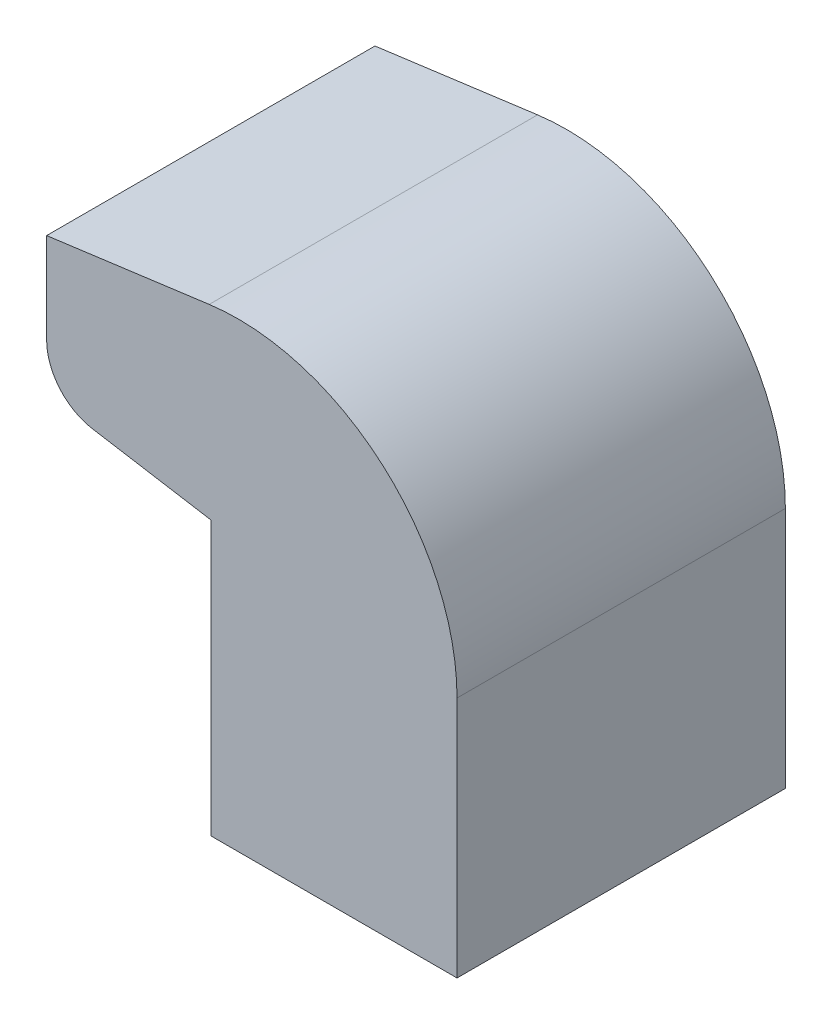
ISO-10303-21;
HEADER;
FILE_DESCRIPTION(('STEP AP214'),'2;1');
FILE_NAME('part.step','',(''),(''),'','','');
FILE_SCHEMA(('AUTOMOTIVE_DESIGN { 1 0 10303 214 1 1 1 1 }'));
ENDSEC;
DATA;
#1=APPLICATION_CONTEXT('core data for automotive mechanical design processes');
#2=APPLICATION_PROTOCOL_DEFINITION('international standard','automotive_design',2000,#1);
#3=PRODUCT_CONTEXT('',#1,'mechanical');
#4=PRODUCT('Part','Part','',(#3));
#5=PRODUCT_RELATED_PRODUCT_CATEGORY('part','',(#4));
#6=PRODUCT_DEFINITION_FORMATION('','',#4);
#7=PRODUCT_DEFINITION_CONTEXT('part definition',#1,'design');
#8=PRODUCT_DEFINITION('design','',#6,#7);
#9=PRODUCT_DEFINITION_SHAPE('','',#8);
#10=(LENGTH_UNIT() NAMED_UNIT(*) SI_UNIT(.MILLI.,.METRE.));
#11=(NAMED_UNIT(*) PLANE_ANGLE_UNIT() SI_UNIT($,.RADIAN.));
#12=(NAMED_UNIT(*) SI_UNIT($,.STERADIAN.) SOLID_ANGLE_UNIT());
#13=UNCERTAINTY_MEASURE_WITH_UNIT(LENGTH_MEASURE(1.E-05),#10,'distance_accuracy_value','');
#14=(GEOMETRIC_REPRESENTATION_CONTEXT(3) GLOBAL_UNCERTAINTY_ASSIGNED_CONTEXT((#13)) GLOBAL_UNIT_ASSIGNED_CONTEXT((#10,
#11,#12)) REPRESENTATION_CONTEXT('',''));
#15=CARTESIAN_POINT('',(0.,0.,0.));
#16=DIRECTION('',(0.,0.,1.));
#17=DIRECTION('',(1.,0.,0.));
#18=AXIS2_PLACEMENT_3D('',#15,#16,#17);
#19=CARTESIAN_POINT('',(0.,0.,30.));
#20=DIRECTION('',(0.,1.,0.));
#21=DIRECTION('',(0.,0.,1.));
#22=AXIS2_PLACEMENT_3D('',#19,#20,#21);
#23=PLANE('',#22);
#24=DIRECTION('',(-1.,0.,0.));
#25=VECTOR('',#24,1.);
#26=CARTESIAN_POINT('',(0.,0.,25.));
#27=LINE('',#26,#25);
#28=CARTESIAN_POINT('',(40.,0.,25.));
#29=VERTEX_POINT('',#28);
#30=CARTESIAN_POINT('',(5.,0.,25.));
#31=VERTEX_POINT('',#30);
#32=EDGE_CURVE('E168',#29,#31,#27,.T.);
#33=ORIENTED_EDGE('',*,*,#32,.T.);
#34=DIRECTION('',(0.,0.,-1.));
#35=VECTOR('',#34,1.);
#36=CARTESIAN_POINT('',(5.,0.,30.));
#37=LINE('',#36,#35);
#38=CARTESIAN_POINT('',(5.,0.,-25.));
#39=VERTEX_POINT('',#38);
#40=EDGE_CURVE('E170',#31,#39,#37,.T.);
#41=ORIENTED_EDGE('',*,*,#40,.T.);
#42=DIRECTION('',(1.,0.,0.));
#43=VECTOR('',#42,1.);
#44=CARTESIAN_POINT('',(45.,0.,-25.));
#45=LINE('',#44,#43);
#46=CARTESIAN_POINT('',(40.,0.,-25.));
#47=VERTEX_POINT('',#46);
#48=EDGE_CURVE('E130',#39,#47,#45,.T.);
#49=ORIENTED_EDGE('',*,*,#48,.T.);
#50=DIRECTION('',(0.,0.,1.));
#51=VECTOR('',#50,1.);
#52=CARTESIAN_POINT('',(40.,0.,30.));
#53=LINE('',#52,#51);
#54=EDGE_CURVE('E166',#47,#29,#53,.T.);
#55=ORIENTED_EDGE('',*,*,#54,.T.);
#56=EDGE_LOOP('',(#33,#41,#49,#55));
#57=FACE_BOUND('',#56,.T.);
#58=ADVANCED_FACE('F34',(#57),#23,.F.);
#59=CARTESIAN_POINT('',(45.,0.,30.));
#60=DIRECTION('',(-1.,0.,0.));
#61=DIRECTION('',(0.,0.,1.));
#62=AXIS2_PLACEMENT_3D('',#59,#60,#61);
#63=PLANE('',#62);
#64=DIRECTION('',(0.,1.,0.));
#65=VECTOR('',#64,1.);
#66=CARTESIAN_POINT('',(45.,0.,30.));
#67=LINE('',#66,#65);
#68=CARTESIAN_POINT('',(45.,5.00000000000003,30.));
#69=VERTEX_POINT('',#68);
#70=CARTESIAN_POINT('',(45.,49.3126774655425,30.));
#71=VERTEX_POINT('',#70);
#72=EDGE_CURVE('E110',#69,#71,#67,.T.);
#73=ORIENTED_EDGE('',*,*,#72,.F.);
#74=DIRECTION('',(0.,0.,-1.));
#75=VECTOR('',#74,1.);
#76=CARTESIAN_POINT('',(45.,5.00000000000003,30.));
#77=LINE('',#76,#75);
#78=CARTESIAN_POINT('',(45.,5.00000000000003,-30.));
#79=VERTEX_POINT('',#78);
#80=EDGE_CURVE('E177',#69,#79,#77,.T.);
#81=ORIENTED_EDGE('',*,*,#80,.T.);
#82=DIRECTION('',(0.,1.,0.));
#83=VECTOR('',#82,1.);
#84=CARTESIAN_POINT('',(45.,0.,-30.));
#85=LINE('',#84,#83);
#86=CARTESIAN_POINT('',(45.,49.3126774655425,-30.));
#87=VERTEX_POINT('',#86);
#88=EDGE_CURVE('E127',#79,#87,#85,.T.);
#89=ORIENTED_EDGE('',*,*,#88,.T.);
#90=DIRECTION('',(0.,0.,-1.));
#91=VECTOR('',#90,1.);
#92=CARTESIAN_POINT('',(45.,49.3126774655425,30.));
#93=LINE('',#92,#91);
#94=EDGE_CURVE('E124',#71,#87,#93,.T.);
#95=ORIENTED_EDGE('',*,*,#94,.F.);
#96=EDGE_LOOP('',(#73,#81,#89,#95));
#97=FACE_BOUND('',#96,.T.);
#98=ADVANCED_FACE('F125',(#97),#63,.F.);
#99=CARTESIAN_POINT('',(5.,49.3126774655425,30.));
#100=DIRECTION('',(0.,0.,-1.));
#101=DIRECTION('',(-1.,0.,0.));
#102=AXIS2_PLACEMENT_3D('',#99,#100,#101);
#103=CYLINDRICAL_SURFACE('',#102,40.);
#104=CARTESIAN_POINT('',(5.,49.3126774655425,-30.));
#105=DIRECTION('',(0.,0.,1.));
#106=DIRECTION('',(-1.,0.,0.));
#107=AXIS2_PLACEMENT_3D('',#104,#105,#106);
#108=CIRCLE('',#107,40.);
#109=CARTESIAN_POINT('',(-0.286548803640719,88.9617934928479,-30.));
#110=VERTEX_POINT('',#109);
#111=EDGE_CURVE('E148',#87,#110,#108,.T.);
#112=ORIENTED_EDGE('',*,*,#111,.T.);
#113=DIRECTION('',(0.,0.,-1.));
#114=VECTOR('',#113,1.);
#115=CARTESIAN_POINT('',(-0.286548803640719,88.9617934928479,30.));
#116=LINE('',#115,#114);
#117=CARTESIAN_POINT('',(-0.286548803640719,88.9617934928479,30.));
#118=VERTEX_POINT('',#117);
#119=EDGE_CURVE('E131',#118,#110,#116,.T.);
#120=ORIENTED_EDGE('',*,*,#119,.F.);
#121=CARTESIAN_POINT('',(5.,49.3126774655425,30.));
#122=DIRECTION('',(0.,0.,1.));
#123=DIRECTION('',(-1.,0.,0.));
#124=AXIS2_PLACEMENT_3D('',#121,#122,#123);
#125=CIRCLE('',#124,40.);
#126=EDGE_CURVE('E114',#71,#118,#125,.T.);
#127=ORIENTED_EDGE('',*,*,#126,.F.);
#128=ORIENTED_EDGE('',*,*,#94,.T.);
#129=EDGE_LOOP('',(#112,#120,#127,#128));
#130=FACE_BOUND('',#129,.T.);
#131=ADVANCED_FACE('F133',(#130),#103,.T.);
#132=CARTESIAN_POINT('',(-30.,85.,30.));
#133=DIRECTION('',(0.132163720091018,-0.991227900682635,0.));
#134=DIRECTION('',(0.991227900682635,0.132163720091018,0.));
#135=AXIS2_PLACEMENT_3D('',#132,#133,#134);
#136=PLANE('',#135);
#137=DIRECTION('',(-0.991227900682635,-0.132163720091018,0.));
#138=VECTOR('',#137,1.);
#139=CARTESIAN_POINT('',(-30.,85.,-30.));
#140=LINE('',#139,#138);
#141=CARTESIAN_POINT('',(-30.,85.,-30.));
#142=VERTEX_POINT('',#141);
#143=EDGE_CURVE('E151',#110,#142,#140,.T.);
#144=ORIENTED_EDGE('',*,*,#143,.T.);
#145=DIRECTION('',(0.,0.,-1.));
#146=VECTOR('',#145,1.);
#147=CARTESIAN_POINT('',(-30.,85.,30.));
#148=LINE('',#147,#146);
#149=CARTESIAN_POINT('',(-30.,85.,30.));
#150=VERTEX_POINT('',#149);
#151=EDGE_CURVE('E161',#150,#142,#148,.T.);
#152=ORIENTED_EDGE('',*,*,#151,.F.);
#153=DIRECTION('',(-0.991227900682635,-0.132163720091018,0.));
#154=VECTOR('',#153,1.);
#155=CARTESIAN_POINT('',(-30.,85.,30.));
#156=LINE('',#155,#154);
#157=EDGE_CURVE('E136',#118,#150,#156,.T.);
#158=ORIENTED_EDGE('',*,*,#157,.F.);
#159=ORIENTED_EDGE('',*,*,#119,.T.);
#160=EDGE_LOOP('',(#144,#152,#158,#159));
#161=FACE_BOUND('',#160,.T.);
#162=ADVANCED_FACE('F226',(#161),#136,.F.);
#163=CARTESIAN_POINT('',(-30.,60.,30.));
#164=DIRECTION('',(1.,0.,0.));
#165=DIRECTION('',(0.,0.,-1.));
#166=AXIS2_PLACEMENT_3D('',#163,#164,#165);
#167=PLANE('',#166);
#168=DIRECTION('',(0.,-1.,0.));
#169=VECTOR('',#168,1.);
#170=CARTESIAN_POINT('',(-30.,60.,-30.));
#171=LINE('',#170,#169);
#172=CARTESIAN_POINT('',(-30.,68.4712708838304,-30.));
#173=VERTEX_POINT('',#172);
#174=EDGE_CURVE('E153',#142,#173,#171,.T.);
#175=ORIENTED_EDGE('',*,*,#174,.T.);
#176=DIRECTION('',(0.,0.,-1.));
#177=VECTOR('',#176,1.);
#178=CARTESIAN_POINT('',(-30.,68.4712708838304,30.));
#179=LINE('',#178,#177);
#180=CARTESIAN_POINT('',(-30.,68.4712708838304,30.));
#181=VERTEX_POINT('',#180);
#182=EDGE_CURVE('E42',#173,#181,#179,.F.);
#183=ORIENTED_EDGE('',*,*,#182,.T.);
#184=DIRECTION('',(0.,-1.,0.));
#185=VECTOR('',#184,1.);
#186=CARTESIAN_POINT('',(-30.,60.,30.));
#187=LINE('',#186,#185);
#188=EDGE_CURVE('E138',#150,#181,#187,.T.);
#189=ORIENTED_EDGE('',*,*,#188,.F.);
#190=ORIENTED_EDGE('',*,*,#151,.T.);
#191=EDGE_LOOP('',(#175,#183,#189,#190));
#192=FACE_BOUND('',#191,.T.);
#193=ADVANCED_FACE('F258',(#192),#167,.F.);
#194=CARTESIAN_POINT('',(0.,55.,30.));
#195=DIRECTION('',(0.164398987305357,0.986393923832144,0.));
#196=DIRECTION('',(-0.986393923832144,0.164398987305357,0.));
#197=AXIS2_PLACEMENT_3D('',#194,#195,#196);
#198=PLANE('',#197);
#199=DIRECTION('',(0.986393923832144,-0.164398987305357,0.));
#200=VECTOR('',#199,1.);
#201=CARTESIAN_POINT('',(0.,55.,30.));
#202=LINE('',#201,#200);
#203=CARTESIAN_POINT('',(-21.6439898730536,58.6073316455089,30.));
#204=VERTEX_POINT('',#203);
#205=CARTESIAN_POINT('',(0.,55.,30.));
#206=VERTEX_POINT('',#205);
#207=EDGE_CURVE('E142',#204,#206,#202,.T.);
#208=ORIENTED_EDGE('',*,*,#207,.F.);
#209=DIRECTION('',(0.,0.,-1.));
#210=VECTOR('',#209,1.);
#211=CARTESIAN_POINT('',(-21.6439898730536,58.6073316455089,30.));
#212=LINE('',#211,#210);
#213=CARTESIAN_POINT('',(-21.6439898730536,58.6073316455089,-30.));
#214=VERTEX_POINT('',#213);
#215=EDGE_CURVE('E181',#204,#214,#212,.T.);
#216=ORIENTED_EDGE('',*,*,#215,.T.);
#217=DIRECTION('',(0.986393923832144,-0.164398987305357,0.));
#218=VECTOR('',#217,1.);
#219=CARTESIAN_POINT('',(0.,55.,-30.));
#220=LINE('',#219,#218);
#221=CARTESIAN_POINT('',(0.,55.,-30.));
#222=VERTEX_POINT('',#221);
#223=EDGE_CURVE('E155',#214,#222,#220,.T.);
#224=ORIENTED_EDGE('',*,*,#223,.T.);
#225=DIRECTION('',(0.,0.,-1.));
#226=VECTOR('',#225,1.);
#227=CARTESIAN_POINT('',(0.,55.,30.));
#228=LINE('',#227,#226);
#229=EDGE_CURVE('E146',#206,#222,#228,.T.);
#230=ORIENTED_EDGE('',*,*,#229,.F.);
#231=EDGE_LOOP('',(#208,#216,#224,#230));
#232=FACE_BOUND('',#231,.T.);
#233=ADVANCED_FACE('F196',(#232),#198,.F.);
#234=CARTESIAN_POINT('',(0.,0.,30.));
#235=DIRECTION('',(1.,0.,0.));
#236=DIRECTION('',(0.,0.,-1.));
#237=AXIS2_PLACEMENT_3D('',#234,#235,#236);
#238=PLANE('',#237);
#239=DIRECTION('',(0.,-1.,0.));
#240=VECTOR('',#239,1.);
#241=CARTESIAN_POINT('',(0.,0.,-30.));
#242=LINE('',#241,#240);
#243=CARTESIAN_POINT('',(0.,5.00000000000003,-30.));
#244=VERTEX_POINT('',#243);
#245=EDGE_CURVE('E121',#222,#244,#242,.T.);
#246=ORIENTED_EDGE('',*,*,#245,.T.);
#247=DIRECTION('',(0.,0.,1.));
#248=VECTOR('',#247,1.);
#249=CARTESIAN_POINT('',(0.,5.00000000000003,30.));
#250=LINE('',#249,#248);
#251=CARTESIAN_POINT('',(0.,5.00000000000003,30.));
#252=VERTEX_POINT('',#251);
#253=EDGE_CURVE('E173',#244,#252,#250,.T.);
#254=ORIENTED_EDGE('',*,*,#253,.T.);
#255=DIRECTION('',(0.,-1.,0.));
#256=VECTOR('',#255,1.);
#257=CARTESIAN_POINT('',(0.,0.,30.));
#258=LINE('',#257,#256);
#259=EDGE_CURVE('E144',#206,#252,#258,.T.);
#260=ORIENTED_EDGE('',*,*,#259,.F.);
#261=ORIENTED_EDGE('',*,*,#229,.T.);
#262=EDGE_LOOP('',(#246,#254,#260,#261));
#263=FACE_BOUND('',#262,.T.);
#264=ADVANCED_FACE('F205',(#263),#238,.F.);
#265=CARTESIAN_POINT('',(5.,49.3126774655425,30.));
#266=DIRECTION('',(0.,0.,-1.));
#267=DIRECTION('',(-1.,0.,0.));
#268=AXIS2_PLACEMENT_3D('',#265,#266,#267);
#269=PLANE('',#268);
#270=ORIENTED_EDGE('',*,*,#188,.T.);
#271=CARTESIAN_POINT('',(-20.,68.4712708838304,30.));
#272=DIRECTION('',(0.,0.,-1.));
#273=DIRECTION('',(-1.,0.,0.));
#274=AXIS2_PLACEMENT_3D('',#271,#272,#273);
#275=CIRCLE('',#274,10.);
#276=EDGE_CURVE('E11',#181,#204,#275,.F.);
#277=ORIENTED_EDGE('',*,*,#276,.T.);
#278=ORIENTED_EDGE('',*,*,#207,.T.);
#279=ORIENTED_EDGE('',*,*,#259,.T.);
#280=DIRECTION('',(1.,0.,0.));
#281=VECTOR('',#280,1.);
#282=CARTESIAN_POINT('',(5.,5.00000000000003,30.));
#283=LINE('',#282,#281);
#284=EDGE_CURVE('E118',#252,#69,#283,.T.);
#285=ORIENTED_EDGE('',*,*,#284,.T.);
#286=ORIENTED_EDGE('',*,*,#72,.T.);
#287=ORIENTED_EDGE('',*,*,#126,.T.);
#288=ORIENTED_EDGE('',*,*,#157,.T.);
#289=EDGE_LOOP('',(#270,#277,#278,#279,#285,#286,#287,#288));
#290=FACE_BOUND('',#289,.T.);
#291=ADVANCED_FACE('F112',(#290),#269,.F.);
#292=CARTESIAN_POINT('',(5.,49.3126774655425,-30.));
#293=DIRECTION('',(0.,0.,-1.));
#294=DIRECTION('',(-1.,0.,0.));
#295=AXIS2_PLACEMENT_3D('',#292,#293,#294);
#296=PLANE('',#295);
#297=ORIENTED_EDGE('',*,*,#223,.F.);
#298=CARTESIAN_POINT('',(-20.,68.4712708838304,-30.));
#299=DIRECTION('',(0.,0.,-1.));
#300=DIRECTION('',(-1.,0.,0.));
#301=AXIS2_PLACEMENT_3D('',#298,#299,#300);
#302=CIRCLE('',#301,10.);
#303=EDGE_CURVE('E56',#214,#173,#302,.T.);
#304=ORIENTED_EDGE('',*,*,#303,.T.);
#305=ORIENTED_EDGE('',*,*,#174,.F.);
#306=ORIENTED_EDGE('',*,*,#143,.F.);
#307=ORIENTED_EDGE('',*,*,#111,.F.);
#308=ORIENTED_EDGE('',*,*,#88,.F.);
#309=DIRECTION('',(-1.,0.,0.));
#310=VECTOR('',#309,1.);
#311=CARTESIAN_POINT('',(0.,5.00000000000003,-30.));
#312=LINE('',#311,#310);
#313=EDGE_CURVE('E179',#79,#244,#312,.T.);
#314=ORIENTED_EDGE('',*,*,#313,.T.);
#315=ORIENTED_EDGE('',*,*,#245,.F.);
#316=EDGE_LOOP('',(#297,#304,#305,#306,#307,#308,#314,#315));
#317=FACE_BOUND('',#316,.T.);
#318=ADVANCED_FACE('F201',(#317),#296,.T.);
#319=CARTESIAN_POINT('',(45.,5.00000000000003,30.));
#320=DIRECTION('',(-0.707106781186549,0.707106781186546,0.));
#321=DIRECTION('',(0.,0.,-1.));
#322=AXIS2_PLACEMENT_3D('',#319,#320,#321);
#323=PLANE('',#322);
#324=DIRECTION('',(0.577350269189625,0.577350269189628,-0.577350269189625));
#325=VECTOR('',#324,1.);
#326=CARTESIAN_POINT('',(26.6666666666667,-13.3333333333334,-11.6666666666667));
#327=LINE('',#326,#325);
#328=EDGE_CURVE('E186',#79,#47,#327,.F.);
#329=ORIENTED_EDGE('',*,*,#328,.F.);
#330=ORIENTED_EDGE('',*,*,#80,.F.);
#331=DIRECTION('',(-0.577350269189625,-0.577350269189628,-0.577350269189625));
#332=VECTOR('',#331,1.);
#333=CARTESIAN_POINT('',(45.,5.00000000000003,30.));
#334=LINE('',#333,#332);
#335=EDGE_CURVE('E149',#29,#69,#334,.F.);
#336=ORIENTED_EDGE('',*,*,#335,.F.);
#337=ORIENTED_EDGE('',*,*,#54,.F.);
#338=EDGE_LOOP('',(#329,#330,#336,#337));
#339=FACE_BOUND('',#338,.T.);
#340=ADVANCED_FACE('F223',(#339),#323,.F.);
#341=CARTESIAN_POINT('',(5.,5.00000000000003,30.));
#342=DIRECTION('',(0.,0.707106781186545,-0.707106781186549));
#343=DIRECTION('',(1.,0.,0.));
#344=AXIS2_PLACEMENT_3D('',#341,#342,#343);
#345=PLANE('',#344);
#346=ORIENTED_EDGE('',*,*,#335,.T.);
#347=ORIENTED_EDGE('',*,*,#284,.F.);
#348=DIRECTION('',(0.577350269189625,-0.577350269189628,-0.577350269189625));
#349=VECTOR('',#348,1.);
#350=CARTESIAN_POINT('',(1.66666666666666,3.33333333333336,28.3333333333333));
#351=LINE('',#350,#349);
#352=EDGE_CURVE('E184',#31,#252,#351,.F.);
#353=ORIENTED_EDGE('',*,*,#352,.F.);
#354=ORIENTED_EDGE('',*,*,#32,.F.);
#355=EDGE_LOOP('',(#346,#347,#353,#354));
#356=FACE_BOUND('',#355,.T.);
#357=ADVANCED_FACE('F221',(#356),#345,.F.);
#358=CARTESIAN_POINT('',(0.,0.,-25.));
#359=DIRECTION('',(0.,-0.707106781186545,-0.707106781186549));
#360=DIRECTION('',(-1.,0.,0.));
#361=AXIS2_PLACEMENT_3D('',#358,#359,#360);
#362=PLANE('',#361);
#363=ORIENTED_EDGE('',*,*,#328,.T.);
#364=ORIENTED_EDGE('',*,*,#48,.F.);
#365=DIRECTION('',(0.577350269189625,-0.577350269189628,0.577350269189625));
#366=VECTOR('',#365,1.);
#367=CARTESIAN_POINT('',(3.33333333333334,1.66666666666667,-26.6666666666667));
#368=LINE('',#367,#366);
#369=EDGE_CURVE('E182',#244,#39,#368,.T.);
#370=ORIENTED_EDGE('',*,*,#369,.F.);
#371=ORIENTED_EDGE('',*,*,#313,.F.);
#372=EDGE_LOOP('',(#363,#364,#370,#371));
#373=FACE_BOUND('',#372,.T.);
#374=ADVANCED_FACE('F214',(#373),#362,.T.);
#375=CARTESIAN_POINT('',(5.,0.,30.));
#376=DIRECTION('',(0.707106781186549,0.707106781186546,0.));
#377=DIRECTION('',(0.,0.,-1.));
#378=AXIS2_PLACEMENT_3D('',#375,#376,#377);
#379=PLANE('',#378);
#380=ORIENTED_EDGE('',*,*,#352,.T.);
#381=ORIENTED_EDGE('',*,*,#253,.F.);
#382=ORIENTED_EDGE('',*,*,#369,.T.);
#383=ORIENTED_EDGE('',*,*,#40,.F.);
#384=EDGE_LOOP('',(#380,#381,#382,#383));
#385=FACE_BOUND('',#384,.T.);
#386=ADVANCED_FACE('F209',(#385),#379,.F.);
#387=CARTESIAN_POINT('',(-20.,68.4712708838304,30.));
#388=DIRECTION('',(0.,0.,-1.));
#389=DIRECTION('',(-1.,0.,0.));
#390=AXIS2_PLACEMENT_3D('',#387,#388,#389);
#391=CYLINDRICAL_SURFACE('',#390,10.);
#392=ORIENTED_EDGE('',*,*,#276,.F.);
#393=ORIENTED_EDGE('',*,*,#182,.F.);
#394=ORIENTED_EDGE('',*,*,#303,.F.);
#395=ORIENTED_EDGE('',*,*,#215,.F.);
#396=EDGE_LOOP('',(#392,#393,#394,#395));
#397=FACE_BOUND('',#396,.T.);
#398=ADVANCED_FACE('F36',(#397),#391,.T.);
#399=CLOSED_SHELL('',(#58,#98,#131,#162,#193,#233,#264,#291,#318,#340,#357,#374,#386,#398));
#400=MANIFOLD_SOLID_BREP('B2',#399);
#401=ADVANCED_BREP_SHAPE_REPRESENTATION('',(#18,#400),#14);
#402=SHAPE_DEFINITION_REPRESENTATION(#9,#401);
ENDSEC;
END-ISO-10303-21;
